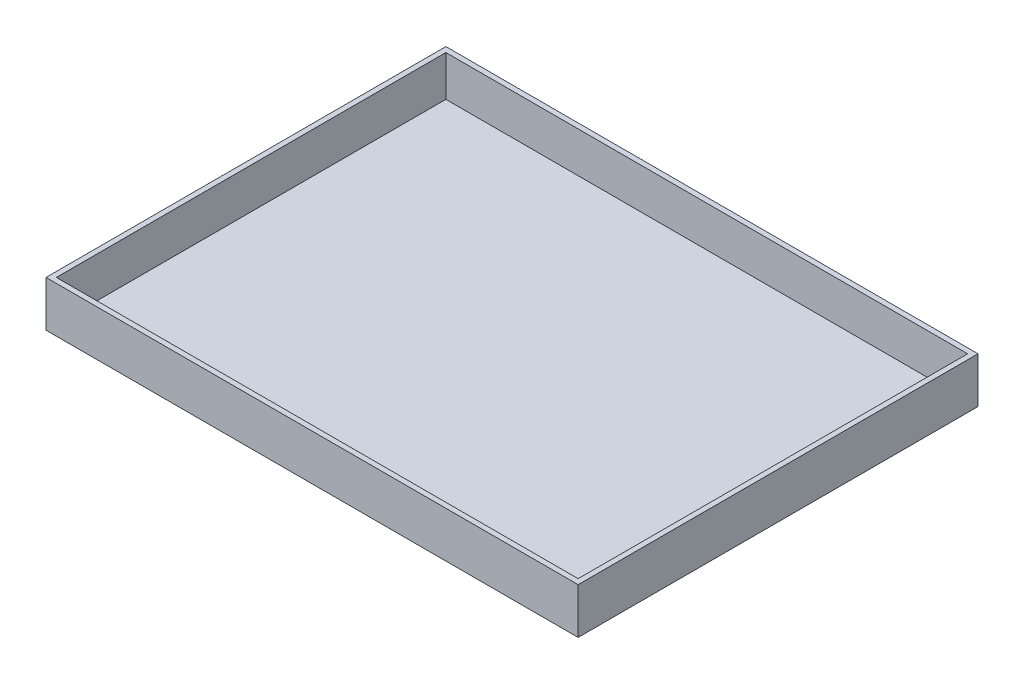
ISO-10303-21;
HEADER;
FILE_DESCRIPTION(('STEP AP214'),'2;1');
FILE_NAME('part.step','',(''),(''),'','','');
FILE_SCHEMA(('AUTOMOTIVE_DESIGN { 1 0 10303 214 1 1 1 1 }'));
ENDSEC;
DATA;
#1=APPLICATION_CONTEXT('core data for automotive mechanical design processes');
#2=APPLICATION_PROTOCOL_DEFINITION('international standard','automotive_design',2000,#1);
#3=PRODUCT_CONTEXT('',#1,'mechanical');
#4=PRODUCT('Part','Part','',(#3));
#5=PRODUCT_RELATED_PRODUCT_CATEGORY('part','',(#4));
#6=PRODUCT_DEFINITION_FORMATION('','',#4);
#7=PRODUCT_DEFINITION_CONTEXT('part definition',#1,'design');
#8=PRODUCT_DEFINITION('design','',#6,#7);
#9=PRODUCT_DEFINITION_SHAPE('','',#8);
#10=(LENGTH_UNIT() NAMED_UNIT(*) SI_UNIT(.MILLI.,.METRE.));
#11=(NAMED_UNIT(*) PLANE_ANGLE_UNIT() SI_UNIT($,.RADIAN.));
#12=(NAMED_UNIT(*) SI_UNIT($,.STERADIAN.) SOLID_ANGLE_UNIT());
#13=UNCERTAINTY_MEASURE_WITH_UNIT(LENGTH_MEASURE(1.E-05),#10,'distance_accuracy_value','');
#14=(GEOMETRIC_REPRESENTATION_CONTEXT(3) GLOBAL_UNCERTAINTY_ASSIGNED_CONTEXT((#13)) GLOBAL_UNIT_ASSIGNED_CONTEXT((#10,
#11,#12)) REPRESENTATION_CONTEXT('',''));
#15=CARTESIAN_POINT('',(0.,0.,0.));
#16=DIRECTION('',(0.,0.,1.));
#17=DIRECTION('',(1.,0.,0.));
#18=AXIS2_PLACEMENT_3D('',#15,#16,#17);
#19=CARTESIAN_POINT('',(1307.5,260.,982.5));
#20=DIRECTION('',(-1.,0.,0.));
#21=DIRECTION('',(0.,0.,1.));
#22=AXIS2_PLACEMENT_3D('',#19,#20,#21);
#23=PLANE('',#22);
#24=DIRECTION('',(0.,0.,-1.));
#25=VECTOR('',#24,1.);
#26=CARTESIAN_POINT('',(1307.5,224.694,982.5));
#27=LINE('',#26,#25);
#28=CARTESIAN_POINT('',(1307.5,224.694,982.5));
#29=VERTEX_POINT('',#28);
#30=CARTESIAN_POINT('',(1307.5,224.694,-982.5));
#31=VERTEX_POINT('',#30);
#32=EDGE_CURVE('E101',#29,#31,#27,.T.);
#33=ORIENTED_EDGE('',*,*,#32,.F.);
#34=DIRECTION('',(0.,-1.,0.));
#35=VECTOR('',#34,1.);
#36=CARTESIAN_POINT('',(1307.5,260.,982.5));
#37=LINE('',#36,#35);
#38=CARTESIAN_POINT('',(1307.5,0.,982.5));
#39=VERTEX_POINT('',#38);
#40=EDGE_CURVE('E110',#29,#39,#37,.T.);
#41=ORIENTED_EDGE('',*,*,#40,.T.);
#42=DIRECTION('',(0.,0.,-1.));
#43=VECTOR('',#42,1.);
#44=CARTESIAN_POINT('',(1307.5,0.,982.5));
#45=LINE('',#44,#43);
#46=CARTESIAN_POINT('',(1307.5,0.,-982.5));
#47=VERTEX_POINT('',#46);
#48=EDGE_CURVE('E172',#39,#47,#45,.T.);
#49=ORIENTED_EDGE('',*,*,#48,.T.);
#50=DIRECTION('',(0.,-1.,0.));
#51=VECTOR('',#50,1.);
#52=CARTESIAN_POINT('',(1307.5,260.,-982.5));
#53=LINE('',#52,#51);
#54=EDGE_CURVE('E112',#31,#47,#53,.T.);
#55=ORIENTED_EDGE('',*,*,#54,.F.);
#56=EDGE_LOOP('',(#33,#41,#49,#55));
#57=FACE_BOUND('',#56,.T.);
#58=ADVANCED_FACE('F37',(#57),#23,.F.);
#59=CARTESIAN_POINT('',(-1307.5,260.,-982.5));
#60=DIRECTION('',(0.,0.,1.));
#61=DIRECTION('',(1.,0.,0.));
#62=AXIS2_PLACEMENT_3D('',#59,#60,#61);
#63=PLANE('',#62);
#64=DIRECTION('',(-1.,0.,0.));
#65=VECTOR('',#64,1.);
#66=CARTESIAN_POINT('',(1307.5,224.694,-982.5));
#67=LINE('',#66,#65);
#68=CARTESIAN_POINT('',(-1307.5,224.694,-982.5));
#69=VERTEX_POINT('',#68);
#70=EDGE_CURVE('E113',#31,#69,#67,.T.);
#71=ORIENTED_EDGE('',*,*,#70,.F.);
#72=ORIENTED_EDGE('',*,*,#54,.T.);
#73=DIRECTION('',(-1.,0.,0.));
#74=VECTOR('',#73,1.);
#75=CARTESIAN_POINT('',(-1307.5,0.,-982.5));
#76=LINE('',#75,#74);
#77=CARTESIAN_POINT('',(-1307.5,0.,-982.5));
#78=VERTEX_POINT('',#77);
#79=EDGE_CURVE('E174',#47,#78,#76,.T.);
#80=ORIENTED_EDGE('',*,*,#79,.T.);
#81=DIRECTION('',(0.,-1.,0.));
#82=VECTOR('',#81,1.);
#83=CARTESIAN_POINT('',(-1307.5,260.,-982.5));
#84=LINE('',#83,#82);
#85=EDGE_CURVE('E121',#69,#78,#84,.T.);
#86=ORIENTED_EDGE('',*,*,#85,.F.);
#87=EDGE_LOOP('',(#71,#72,#80,#86));
#88=FACE_BOUND('',#87,.T.);
#89=ADVANCED_FACE('F185',(#88),#63,.F.);
#90=CARTESIAN_POINT('',(-1307.5,260.,982.5));
#91=DIRECTION('',(1.,0.,0.));
#92=DIRECTION('',(0.,0.,-1.));
#93=AXIS2_PLACEMENT_3D('',#90,#91,#92);
#94=PLANE('',#93);
#95=DIRECTION('',(0.,0.,1.));
#96=VECTOR('',#95,1.);
#97=CARTESIAN_POINT('',(-1307.5,224.694,982.5));
#98=LINE('',#97,#96);
#99=CARTESIAN_POINT('',(-1307.5,224.694,982.5));
#100=VERTEX_POINT('',#99);
#101=EDGE_CURVE('E52',#69,#100,#98,.T.);
#102=ORIENTED_EDGE('',*,*,#101,.F.);
#103=ORIENTED_EDGE('',*,*,#85,.T.);
#104=DIRECTION('',(0.,0.,1.));
#105=VECTOR('',#104,1.);
#106=CARTESIAN_POINT('',(-1307.5,0.,982.5));
#107=LINE('',#106,#105);
#108=CARTESIAN_POINT('',(-1307.5,0.,982.5));
#109=VERTEX_POINT('',#108);
#110=EDGE_CURVE('E123',#78,#109,#107,.T.);
#111=ORIENTED_EDGE('',*,*,#110,.T.);
#112=DIRECTION('',(0.,-1.,0.));
#113=VECTOR('',#112,1.);
#114=CARTESIAN_POINT('',(-1307.5,260.,982.5));
#115=LINE('',#114,#113);
#116=EDGE_CURVE('E119',#100,#109,#115,.T.);
#117=ORIENTED_EDGE('',*,*,#116,.F.);
#118=EDGE_LOOP('',(#102,#103,#111,#117));
#119=FACE_BOUND('',#118,.T.);
#120=ADVANCED_FACE('F179',(#119),#94,.F.);
#121=CARTESIAN_POINT('',(-1307.5,260.,982.5));
#122=DIRECTION('',(0.,0.,-1.));
#123=DIRECTION('',(-1.,0.,0.));
#124=AXIS2_PLACEMENT_3D('',#121,#122,#123);
#125=PLANE('',#124);
#126=DIRECTION('',(1.,0.,0.));
#127=VECTOR('',#126,1.);
#128=CARTESIAN_POINT('',(1307.5,224.694,982.5));
#129=LINE('',#128,#127);
#130=EDGE_CURVE('E98',#100,#29,#129,.T.);
#131=ORIENTED_EDGE('',*,*,#130,.F.);
#132=ORIENTED_EDGE('',*,*,#116,.T.);
#133=DIRECTION('',(1.,0.,0.));
#134=VECTOR('',#133,1.);
#135=CARTESIAN_POINT('',(-1307.5,0.,982.5));
#136=LINE('',#135,#134);
#137=EDGE_CURVE('E117',#109,#39,#136,.T.);
#138=ORIENTED_EDGE('',*,*,#137,.T.);
#139=ORIENTED_EDGE('',*,*,#40,.F.);
#140=EDGE_LOOP('',(#131,#132,#138,#139));
#141=FACE_BOUND('',#140,.T.);
#142=ADVANCED_FACE('F115',(#141),#125,.F.);
#143=CARTESIAN_POINT('',(0.,0.,0.));
#144=DIRECTION('',(0.,-1.,0.));
#145=DIRECTION('',(0.,0.,-1.));
#146=AXIS2_PLACEMENT_3D('',#143,#144,#145);
#147=PLANE('',#146);
#148=ORIENTED_EDGE('',*,*,#48,.F.);
#149=ORIENTED_EDGE('',*,*,#137,.F.);
#150=ORIENTED_EDGE('',*,*,#110,.F.);
#151=ORIENTED_EDGE('',*,*,#79,.F.);
#152=EDGE_LOOP('',(#148,#149,#150,#151));
#153=FACE_BOUND('',#152,.T.);
#154=ADVANCED_FACE('F183',(#153),#147,.T.);
#155=CARTESIAN_POINT('',(0.,224.694,0.));
#156=DIRECTION('',(0.,1.,0.));
#157=DIRECTION('',(0.,0.,1.));
#158=AXIS2_PLACEMENT_3D('',#155,#156,#157);
#159=PLANE('',#158);
#160=DIRECTION('',(1.,0.,0.));
#161=VECTOR('',#160,1.);
#162=CARTESIAN_POINT('',(-1307.5,224.694,957.1));
#163=LINE('',#162,#161);
#164=CARTESIAN_POINT('',(-1282.1,224.694,957.1));
#165=VERTEX_POINT('',#164);
#166=CARTESIAN_POINT('',(1282.1,224.694,957.1));
#167=VERTEX_POINT('',#166);
#168=EDGE_CURVE('E11',#165,#167,#163,.T.);
#169=ORIENTED_EDGE('',*,*,#168,.F.);
#170=DIRECTION('',(0.,0.,1.));
#171=VECTOR('',#170,1.);
#172=CARTESIAN_POINT('',(-1282.1,224.694,982.5));
#173=LINE('',#172,#171);
#174=CARTESIAN_POINT('',(-1282.1,224.694,-957.1));
#175=VERTEX_POINT('',#174);
#176=EDGE_CURVE('E163',#175,#165,#173,.T.);
#177=ORIENTED_EDGE('',*,*,#176,.F.);
#178=DIRECTION('',(-1.,0.,0.));
#179=VECTOR('',#178,1.);
#180=CARTESIAN_POINT('',(-1307.5,224.694,-957.1));
#181=LINE('',#180,#179);
#182=CARTESIAN_POINT('',(1282.1,224.694,-957.1));
#183=VERTEX_POINT('',#182);
#184=EDGE_CURVE('E159',#183,#175,#181,.T.);
#185=ORIENTED_EDGE('',*,*,#184,.F.);
#186=DIRECTION('',(0.,0.,-1.));
#187=VECTOR('',#186,1.);
#188=CARTESIAN_POINT('',(1282.1,224.694,982.5));
#189=LINE('',#188,#187);
#190=EDGE_CURVE('E60',#167,#183,#189,.T.);
#191=ORIENTED_EDGE('',*,*,#190,.F.);
#192=EDGE_LOOP('',(#169,#177,#185,#191));
#193=FACE_BOUND('',#192,.T.);
#194=ORIENTED_EDGE('',*,*,#101,.T.);
#195=ORIENTED_EDGE('',*,*,#130,.T.);
#196=ORIENTED_EDGE('',*,*,#32,.T.);
#197=ORIENTED_EDGE('',*,*,#70,.T.);
#198=EDGE_LOOP('',(#194,#195,#196,#197));
#199=FACE_BOUND('',#198,.T.);
#200=ADVANCED_FACE('F100',(#193,#199),#159,.T.);
#201=CARTESIAN_POINT('',(1282.1,260.,982.5));
#202=DIRECTION('',(-1.,0.,0.));
#203=DIRECTION('',(0.,0.,1.));
#204=AXIS2_PLACEMENT_3D('',#201,#202,#203);
#205=PLANE('',#204);
#206=DIRECTION('',(0.,-1.,0.));
#207=VECTOR('',#206,1.);
#208=CARTESIAN_POINT('',(1282.1,260.,957.1));
#209=LINE('',#208,#207);
#210=CARTESIAN_POINT('',(1282.1,25.4,957.1));
#211=VERTEX_POINT('',#210);
#212=EDGE_CURVE('E144',#167,#211,#209,.T.);
#213=ORIENTED_EDGE('',*,*,#212,.F.);
#214=ORIENTED_EDGE('',*,*,#190,.T.);
#215=DIRECTION('',(0.,-1.,0.));
#216=VECTOR('',#215,1.);
#217=CARTESIAN_POINT('',(1282.1,260.,-957.1));
#218=LINE('',#217,#216);
#219=CARTESIAN_POINT('',(1282.1,25.4,-957.1));
#220=VERTEX_POINT('',#219);
#221=EDGE_CURVE('E139',#183,#220,#218,.T.);
#222=ORIENTED_EDGE('',*,*,#221,.T.);
#223=DIRECTION('',(0.,0.,-1.));
#224=VECTOR('',#223,1.);
#225=CARTESIAN_POINT('',(1282.1,25.4,0.));
#226=LINE('',#225,#224);
#227=EDGE_CURVE('E129',#211,#220,#226,.T.);
#228=ORIENTED_EDGE('',*,*,#227,.F.);
#229=EDGE_LOOP('',(#213,#214,#222,#228));
#230=FACE_BOUND('',#229,.T.);
#231=ADVANCED_FACE('F153',(#230),#205,.T.);
#232=CARTESIAN_POINT('',(-1307.5,260.,-957.1));
#233=DIRECTION('',(0.,0.,1.));
#234=DIRECTION('',(1.,0.,0.));
#235=AXIS2_PLACEMENT_3D('',#232,#233,#234);
#236=PLANE('',#235);
#237=ORIENTED_EDGE('',*,*,#221,.F.);
#238=ORIENTED_EDGE('',*,*,#184,.T.);
#239=DIRECTION('',(0.,-1.,0.));
#240=VECTOR('',#239,1.);
#241=CARTESIAN_POINT('',(-1282.1,260.,-957.1));
#242=LINE('',#241,#240);
#243=CARTESIAN_POINT('',(-1282.1,25.4,-957.1));
#244=VERTEX_POINT('',#243);
#245=EDGE_CURVE('E134',#175,#244,#242,.T.);
#246=ORIENTED_EDGE('',*,*,#245,.T.);
#247=DIRECTION('',(-1.,0.,0.));
#248=VECTOR('',#247,1.);
#249=CARTESIAN_POINT('',(0.,25.4,-957.1));
#250=LINE('',#249,#248);
#251=EDGE_CURVE('E141',#220,#244,#250,.T.);
#252=ORIENTED_EDGE('',*,*,#251,.F.);
#253=EDGE_LOOP('',(#237,#238,#246,#252));
#254=FACE_BOUND('',#253,.T.);
#255=ADVANCED_FACE('F157',(#254),#236,.T.);
#256=CARTESIAN_POINT('',(-1282.1,260.,982.5));
#257=DIRECTION('',(1.,0.,0.));
#258=DIRECTION('',(0.,0.,-1.));
#259=AXIS2_PLACEMENT_3D('',#256,#257,#258);
#260=PLANE('',#259);
#261=ORIENTED_EDGE('',*,*,#245,.F.);
#262=ORIENTED_EDGE('',*,*,#176,.T.);
#263=DIRECTION('',(0.,-1.,0.));
#264=VECTOR('',#263,1.);
#265=CARTESIAN_POINT('',(-1282.1,260.,957.1));
#266=LINE('',#265,#264);
#267=CARTESIAN_POINT('',(-1282.1,25.4,957.1));
#268=VERTEX_POINT('',#267);
#269=EDGE_CURVE('E45',#165,#268,#266,.T.);
#270=ORIENTED_EDGE('',*,*,#269,.T.);
#271=DIRECTION('',(0.,0.,1.));
#272=VECTOR('',#271,1.);
#273=CARTESIAN_POINT('',(-1282.1,25.4,0.));
#274=LINE('',#273,#272);
#275=EDGE_CURVE('E136',#244,#268,#274,.T.);
#276=ORIENTED_EDGE('',*,*,#275,.F.);
#277=EDGE_LOOP('',(#261,#262,#270,#276));
#278=FACE_BOUND('',#277,.T.);
#279=ADVANCED_FACE('F162',(#278),#260,.T.);
#280=CARTESIAN_POINT('',(-1307.5,260.,957.1));
#281=DIRECTION('',(0.,0.,-1.));
#282=DIRECTION('',(-1.,0.,0.));
#283=AXIS2_PLACEMENT_3D('',#280,#281,#282);
#284=PLANE('',#283);
#285=ORIENTED_EDGE('',*,*,#269,.F.);
#286=ORIENTED_EDGE('',*,*,#168,.T.);
#287=ORIENTED_EDGE('',*,*,#212,.T.);
#288=DIRECTION('',(1.,0.,0.));
#289=VECTOR('',#288,1.);
#290=CARTESIAN_POINT('',(0.,25.4,957.1));
#291=LINE('',#290,#289);
#292=EDGE_CURVE('E131',#268,#211,#291,.T.);
#293=ORIENTED_EDGE('',*,*,#292,.F.);
#294=EDGE_LOOP('',(#285,#286,#287,#293));
#295=FACE_BOUND('',#294,.T.);
#296=ADVANCED_FACE('F166',(#295),#284,.T.);
#297=CARTESIAN_POINT('',(0.,25.4,0.));
#298=DIRECTION('',(0.,-1.,0.));
#299=DIRECTION('',(0.,0.,-1.));
#300=AXIS2_PLACEMENT_3D('',#297,#298,#299);
#301=PLANE('',#300);
#302=ORIENTED_EDGE('',*,*,#227,.T.);
#303=ORIENTED_EDGE('',*,*,#251,.T.);
#304=ORIENTED_EDGE('',*,*,#275,.T.);
#305=ORIENTED_EDGE('',*,*,#292,.T.);
#306=EDGE_LOOP('',(#302,#303,#304,#305));
#307=FACE_BOUND('',#306,.T.);
#308=ADVANCED_FACE('F39',(#307),#301,.F.);
#309=CLOSED_SHELL('',(#58,#89,#120,#142,#154,#200,#231,#255,#279,#296,#308));
#310=MANIFOLD_SOLID_BREP('B2',#309);
#311=ADVANCED_BREP_SHAPE_REPRESENTATION('',(#18,#310),#14);
#312=SHAPE_DEFINITION_REPRESENTATION(#9,#311);
ENDSEC;
END-ISO-10303-21;
